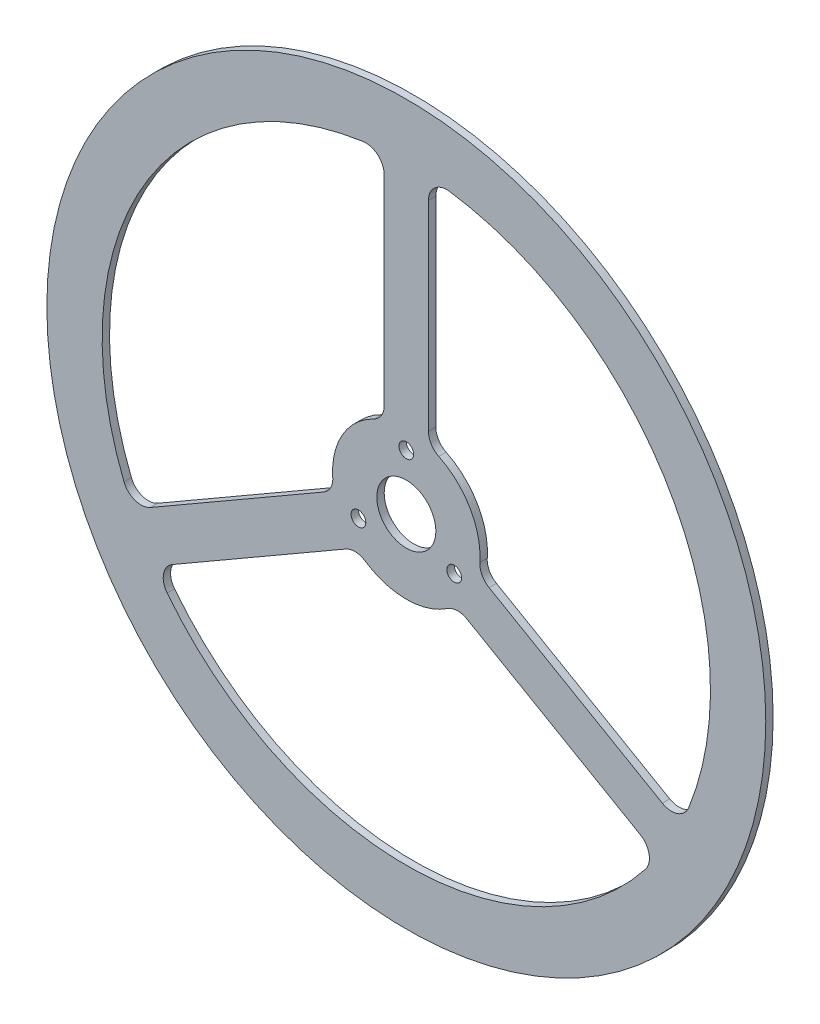
ISO-10303-21;
HEADER;
FILE_DESCRIPTION(('STEP AP214'),'2;1');
FILE_NAME('part.step','',(''),(''),'','','');
FILE_SCHEMA(('AUTOMOTIVE_DESIGN { 1 0 10303 214 1 1 1 1 }'));
ENDSEC;
DATA;
#1=APPLICATION_CONTEXT('core data for automotive mechanical design processes');
#2=APPLICATION_PROTOCOL_DEFINITION('international standard','automotive_design',2000,#1);
#3=PRODUCT_CONTEXT('',#1,'mechanical');
#4=PRODUCT('Part','Part','',(#3));
#5=PRODUCT_RELATED_PRODUCT_CATEGORY('part','',(#4));
#6=PRODUCT_DEFINITION_FORMATION('','',#4);
#7=PRODUCT_DEFINITION_CONTEXT('part definition',#1,'design');
#8=PRODUCT_DEFINITION('design','',#6,#7);
#9=PRODUCT_DEFINITION_SHAPE('','',#8);
#10=(LENGTH_UNIT() NAMED_UNIT(*) SI_UNIT(.MILLI.,.METRE.));
#11=(NAMED_UNIT(*) PLANE_ANGLE_UNIT() SI_UNIT($,.RADIAN.));
#12=(NAMED_UNIT(*) SI_UNIT($,.STERADIAN.) SOLID_ANGLE_UNIT());
#13=UNCERTAINTY_MEASURE_WITH_UNIT(LENGTH_MEASURE(1.E-05),#10,'distance_accuracy_value','');
#14=(GEOMETRIC_REPRESENTATION_CONTEXT(3) GLOBAL_UNCERTAINTY_ASSIGNED_CONTEXT((#13)) GLOBAL_UNIT_ASSIGNED_CONTEXT((#10,
#11,#12)) REPRESENTATION_CONTEXT('',''));
#15=CARTESIAN_POINT('',(0.,0.,0.));
#16=DIRECTION('',(0.,0.,1.));
#17=DIRECTION('',(1.,0.,0.));
#18=AXIS2_PLACEMENT_3D('',#15,#16,#17);
#19=CARTESIAN_POINT('',(0.,0.,2.));
#20=DIRECTION('',(0.,0.,-1.));
#21=DIRECTION('',(-1.,0.,0.));
#22=AXIS2_PLACEMENT_3D('',#19,#20,#21);
#23=CYLINDRICAL_SURFACE('',#22,97.5);
#24=CARTESIAN_POINT('',(0.,0.,2.));
#25=DIRECTION('',(0.,0.,1.));
#26=DIRECTION('',(1.,0.,0.));
#27=AXIS2_PLACEMENT_3D('',#24,#25,#26);
#28=CIRCLE('',#27,97.5);
#29=CARTESIAN_POINT('',(97.5,0.,2.));
#30=VERTEX_POINT('',#29);
#31=EDGE_CURVE('E11',#30,#30,#28,.T.);
#32=ORIENTED_EDGE('',*,*,#31,.F.);
#33=EDGE_LOOP('',(#32));
#34=FACE_BOUND('',#33,.T.);
#35=CARTESIAN_POINT('',(0.,0.,0.));
#36=DIRECTION('',(0.,0.,1.));
#37=DIRECTION('',(1.,0.,0.));
#38=AXIS2_PLACEMENT_3D('',#35,#36,#37);
#39=CIRCLE('',#38,97.5);
#40=CARTESIAN_POINT('',(97.5,0.,0.));
#41=VERTEX_POINT('',#40);
#42=EDGE_CURVE('E36',#41,#41,#39,.T.);
#43=ORIENTED_EDGE('',*,*,#42,.T.);
#44=EDGE_LOOP('',(#43));
#45=FACE_BOUND('',#44,.T.);
#46=ADVANCED_FACE('F33',(#34,#45),#23,.T.);
#47=CARTESIAN_POINT('',(0.,0.,2.));
#48=DIRECTION('',(0.,0.,1.));
#49=DIRECTION('',(1.,0.,0.));
#50=AXIS2_PLACEMENT_3D('',#47,#48,#49);
#51=PLANE('',#50);
#52=CARTESIAN_POINT('',(-12.9903810567666,-7.49999999999988,2.));
#53=DIRECTION('',(0.,0.,-1.));
#54=DIRECTION('',(0.499999999999992,-0.866025403784443,0.));
#55=AXIS2_PLACEMENT_3D('',#52,#53,#54);
#56=CIRCLE('',#55,2.);
#57=CARTESIAN_POINT('',(-11.9903810567667,-9.23205080756877,2.));
#58=VERTEX_POINT('',#57);
#59=EDGE_CURVE('E703',#58,#58,#56,.T.);
#60=ORIENTED_EDGE('',*,*,#59,.T.);
#61=EDGE_LOOP('',(#60));
#62=FACE_BOUND('',#61,.T.);
#63=CARTESIAN_POINT('',(12.9903810567665,-7.50000000000006,2.));
#64=DIRECTION('',(0.,0.,-1.));
#65=DIRECTION('',(0.500000000000004,0.866025403784436,0.));
#66=AXIS2_PLACEMENT_3D('',#63,#64,#65);
#67=CIRCLE('',#66,2.);
#68=CARTESIAN_POINT('',(13.9903810567666,-5.76794919243119,2.));
#69=VERTEX_POINT('',#68);
#70=EDGE_CURVE('E706',#69,#69,#67,.T.);
#71=ORIENTED_EDGE('',*,*,#70,.T.);
#72=EDGE_LOOP('',(#71));
#73=FACE_BOUND('',#72,.T.);
#74=CARTESIAN_POINT('',(0.,15.,2.));
#75=DIRECTION('',(0.,0.,-1.));
#76=DIRECTION('',(-1.,0.,0.));
#77=AXIS2_PLACEMENT_3D('',#74,#75,#76);
#78=CIRCLE('',#77,2.);
#79=CARTESIAN_POINT('',(-2.,15.,2.));
#80=VERTEX_POINT('',#79);
#81=EDGE_CURVE('E716',#80,#80,#78,.T.);
#82=ORIENTED_EDGE('',*,*,#81,.T.);
#83=EDGE_LOOP('',(#82));
#84=FACE_BOUND('',#83,.T.);
#85=CARTESIAN_POINT('',(-24.9422220952236,-1.698692718693,2.));
#86=DIRECTION('',(0.,0.,-1.));
#87=DIRECTION('',(1.,0.,0.));
#88=AXIS2_PLACEMENT_3D('',#85,#86,#87);
#89=CIRCLE('',#88,5.);
#90=CARTESIAN_POINT('',(-19.9537776761789,-1.3589541749544,2.));
#91=VERTEX_POINT('',#90);
#92=CARTESIAN_POINT('',(-22.4422220952236,-6.02881973761519,2.));
#93=VERTEX_POINT('',#92);
#94=EDGE_CURVE('E197',#91,#93,#89,.T.);
#95=ORIENTED_EDGE('',*,*,#94,.T.);
#96=DIRECTION('',(-0.866025403784439,-0.5,0.));
#97=VECTOR('',#96,1.);
#98=CARTESIAN_POINT('',(-22.4422220952236,-6.02881973761519,2.));
#99=LINE('',#98,#97);
#100=CARTESIAN_POINT('',(-69.4374706020631,-33.1615391136723,2.));
#101=VERTEX_POINT('',#100);
#102=EDGE_CURVE('E208',#93,#101,#99,.T.);
#103=ORIENTED_EDGE('',*,*,#102,.T.);
#104=CARTESIAN_POINT('',(-71.9374706020631,-28.8314120947501,2.));
#105=DIRECTION('',(0.,0.,-1.));
#106=DIRECTION('',(-1.,0.,0.));
#107=AXIS2_PLACEMENT_3D('',#104,#105,#106);
#108=CIRCLE('',#107,5.00000000000001);
#109=CARTESIAN_POINT('',(-76.5785977376801,-30.6915031976373,2.));
#110=VERTEX_POINT('',#109);
#111=EDGE_CURVE('E47',#101,#110,#108,.T.);
#112=ORIENTED_EDGE('',*,*,#111,.T.);
#113=CARTESIAN_POINT('',(0.,0.,2.));
#114=DIRECTION('',(0.,0.,-1.));
#115=DIRECTION('',(-1.,0.,0.));
#116=AXIS2_PLACEMENT_3D('',#113,#114,#115);
#117=CIRCLE('',#116,82.5);
#118=CARTESIAN_POINT('',(-11.7096774193548,81.6647626258391,2.));
#119=VERTEX_POINT('',#118);
#120=EDGE_CURVE('E226',#110,#119,#117,.T.);
#121=ORIENTED_EDGE('',*,*,#120,.T.);
#122=CARTESIAN_POINT('',(-11.,76.715383072758,2.));
#123=DIRECTION('',(0.,0.,-1.));
#124=DIRECTION('',(1.,0.,0.));
#125=AXIS2_PLACEMENT_3D('',#122,#123,#124);
#126=CIRCLE('',#125,5.);
#127=CARTESIAN_POINT('',(-6.,76.715383072758,2.));
#128=VERTEX_POINT('',#127);
#129=EDGE_CURVE('E229',#119,#128,#126,.T.);
#130=ORIENTED_EDGE('',*,*,#129,.T.);
#131=DIRECTION('',(0.,-1.,0.));
#132=VECTOR('',#131,1.);
#133=CARTESIAN_POINT('',(-5.99999999999999,22.4499443206436,2.));
#134=LINE('',#133,#132);
#135=CARTESIAN_POINT('',(-5.99999999999999,22.4499443206436,2.));
#136=VERTEX_POINT('',#135);
#137=EDGE_CURVE('E232',#128,#136,#134,.T.);
#138=ORIENTED_EDGE('',*,*,#137,.T.);
#139=CARTESIAN_POINT('',(-11.,22.4499443206436,2.));
#140=DIRECTION('',(0.,0.,-1.));
#141=DIRECTION('',(1.,0.,0.));
#142=AXIS2_PLACEMENT_3D('',#139,#140,#141);
#143=CIRCLE('',#142,5.);
#144=CARTESIAN_POINT('',(-8.8,17.9599554565149,2.));
#145=VERTEX_POINT('',#144);
#146=EDGE_CURVE('E235',#136,#145,#143,.T.);
#147=ORIENTED_EDGE('',*,*,#146,.T.);
#148=CARTESIAN_POINT('',(0.,0.,2.));
#149=DIRECTION('',(0.,0.,1.));
#150=DIRECTION('',(-1.,0.,0.));
#151=AXIS2_PLACEMENT_3D('',#148,#149,#150);
#152=CIRCLE('',#151,20.);
#153=EDGE_CURVE('E205',#145,#91,#152,.T.);
#154=ORIENTED_EDGE('',*,*,#153,.T.);
#155=EDGE_LOOP('',(#95,#103,#112,#121,#130,#138,#147,#154));
#156=FACE_BOUND('',#155,.T.);
#157=CARTESIAN_POINT('',(0.,0.,2.));
#158=DIRECTION('',(0.,0.,-1.));
#159=DIRECTION('',(-1.,0.,0.));
#160=AXIS2_PLACEMENT_3D('',#157,#158,#159);
#161=CIRCLE('',#160,8.);
#162=CARTESIAN_POINT('',(-8.,0.,2.));
#163=VERTEX_POINT('',#162);
#164=EDGE_CURVE('E240',#163,#163,#161,.T.);
#165=ORIENTED_EDGE('',*,*,#164,.T.);
#166=EDGE_LOOP('',(#165));
#167=FACE_BOUND('',#166,.T.);
#168=CARTESIAN_POINT('',(13.9422220952236,-20.7512516019506,2.));
#169=DIRECTION('',(0.,0.,-1.));
#170=DIRECTION('',(-1.,0.,0.));
#171=AXIS2_PLACEMENT_3D('',#168,#169,#170);
#172=CIRCLE('',#171,5.);
#173=CARTESIAN_POINT('',(11.1537776761789,-16.6010012815605,2.));
#174=VERTEX_POINT('',#173);
#175=CARTESIAN_POINT('',(16.4422220952236,-16.4211245830284,2.));
#176=VERTEX_POINT('',#175);
#177=EDGE_CURVE('E270',#174,#176,#172,.T.);
#178=ORIENTED_EDGE('',*,*,#177,.T.);
#179=DIRECTION('',(0.866025403784439,-0.5,0.));
#180=VECTOR('',#179,1.);
#181=CARTESIAN_POINT('',(16.4422220952236,-16.4211245830284,2.));
#182=LINE('',#181,#180);
#183=CARTESIAN_POINT('',(63.4374706020632,-43.5538439590856,2.));
#184=VERTEX_POINT('',#183);
#185=EDGE_CURVE('E273',#176,#184,#182,.T.);
#186=ORIENTED_EDGE('',*,*,#185,.T.);
#187=CARTESIAN_POINT('',(60.9374706020631,-47.8839709780078,2.));
#188=DIRECTION('',(0.,0.,-1.));
#189=DIRECTION('',(1.,0.,0.));
#190=AXIS2_PLACEMENT_3D('',#187,#188,#189);
#191=CIRCLE('',#190,5.);
#192=CARTESIAN_POINT('',(64.8689203183253,-50.9732594282018,2.));
#193=VERTEX_POINT('',#192);
#194=EDGE_CURVE('E55',#184,#193,#191,.T.);
#195=ORIENTED_EDGE('',*,*,#194,.T.);
#196=CARTESIAN_POINT('',(0.,0.,2.));
#197=DIRECTION('',(0.,0.,-1.));
#198=DIRECTION('',(-1.,0.,0.));
#199=AXIS2_PLACEMENT_3D('',#196,#197,#198);
#200=CIRCLE('',#199,82.5);
#201=CARTESIAN_POINT('',(-64.8689203183253,-50.9732594282018,2.));
#202=VERTEX_POINT('',#201);
#203=EDGE_CURVE('E278',#193,#202,#200,.T.);
#204=ORIENTED_EDGE('',*,*,#203,.T.);
#205=CARTESIAN_POINT('',(-60.9374706020631,-47.8839709780078,2.));
#206=DIRECTION('',(0.,0.,-1.));
#207=DIRECTION('',(-1.,0.,0.));
#208=AXIS2_PLACEMENT_3D('',#205,#206,#207);
#209=CIRCLE('',#208,5.00000000000001);
#210=CARTESIAN_POINT('',(-63.4374706020631,-43.5538439590856,2.));
#211=VERTEX_POINT('',#210);
#212=EDGE_CURVE('E281',#202,#211,#209,.T.);
#213=ORIENTED_EDGE('',*,*,#212,.T.);
#214=DIRECTION('',(0.866025403784439,0.5,0.));
#215=VECTOR('',#214,1.);
#216=CARTESIAN_POINT('',(-16.4422220952236,-16.4211245830285,2.));
#217=LINE('',#216,#215);
#218=CARTESIAN_POINT('',(-16.4422220952236,-16.4211245830285,2.));
#219=VERTEX_POINT('',#218);
#220=EDGE_CURVE('E284',#211,#219,#217,.T.);
#221=ORIENTED_EDGE('',*,*,#220,.T.);
#222=CARTESIAN_POINT('',(-13.9422220952236,-20.7512516019506,2.));
#223=DIRECTION('',(0.,0.,-1.));
#224=DIRECTION('',(1.,0.,0.));
#225=AXIS2_PLACEMENT_3D('',#222,#223,#224);
#226=CIRCLE('',#225,5.);
#227=CARTESIAN_POINT('',(-11.1537776761789,-16.6010012815605,2.));
#228=VERTEX_POINT('',#227);
#229=EDGE_CURVE('E287',#219,#228,#226,.T.);
#230=ORIENTED_EDGE('',*,*,#229,.T.);
#231=CARTESIAN_POINT('',(0.,0.,2.));
#232=DIRECTION('',(0.,0.,1.));
#233=DIRECTION('',(-1.,0.,0.));
#234=AXIS2_PLACEMENT_3D('',#231,#232,#233);
#235=CIRCLE('',#234,20.);
#236=EDGE_CURVE('E290',#228,#174,#235,.T.);
#237=ORIENTED_EDGE('',*,*,#236,.T.);
#238=EDGE_LOOP('',(#178,#186,#195,#204,#213,#221,#230,#237));
#239=FACE_BOUND('',#238,.T.);
#240=CARTESIAN_POINT('',(11.,22.4499443206437,2.));
#241=DIRECTION('',(0.,0.,-1.));
#242=DIRECTION('',(-1.,0.,0.));
#243=AXIS2_PLACEMENT_3D('',#240,#241,#242);
#244=CIRCLE('',#243,5.);
#245=CARTESIAN_POINT('',(8.79999999999999,17.9599554565149,2.));
#246=VERTEX_POINT('',#245);
#247=CARTESIAN_POINT('',(5.99999999999999,22.4499443206437,2.));
#248=VERTEX_POINT('',#247);
#249=EDGE_CURVE('E332',#246,#248,#244,.T.);
#250=ORIENTED_EDGE('',*,*,#249,.T.);
#251=DIRECTION('',(0.,1.,0.));
#252=VECTOR('',#251,1.);
#253=CARTESIAN_POINT('',(5.99999999999999,22.4499443206437,2.));
#254=LINE('',#253,#252);
#255=CARTESIAN_POINT('',(5.99999999999999,76.715383072758,2.));
#256=VERTEX_POINT('',#255);
#257=EDGE_CURVE('E335',#248,#256,#254,.T.);
#258=ORIENTED_EDGE('',*,*,#257,.T.);
#259=CARTESIAN_POINT('',(11.,76.715383072758,2.));
#260=DIRECTION('',(0.,0.,-1.));
#261=DIRECTION('',(-1.,0.,0.));
#262=AXIS2_PLACEMENT_3D('',#259,#260,#261);
#263=CIRCLE('',#262,5.);
#264=CARTESIAN_POINT('',(11.7096774193548,81.6647626258391,2.));
#265=VERTEX_POINT('',#264);
#266=EDGE_CURVE('E339',#256,#265,#263,.T.);
#267=ORIENTED_EDGE('',*,*,#266,.T.);
#268=CARTESIAN_POINT('',(0.,0.,2.));
#269=DIRECTION('',(0.,0.,-1.));
#270=DIRECTION('',(-1.,0.,0.));
#271=AXIS2_PLACEMENT_3D('',#268,#269,#270);
#272=CIRCLE('',#271,82.5);
#273=CARTESIAN_POINT('',(76.5785977376801,-30.6915031976373,2.));
#274=VERTEX_POINT('',#273);
#275=EDGE_CURVE('E342',#265,#274,#272,.T.);
#276=ORIENTED_EDGE('',*,*,#275,.T.);
#277=CARTESIAN_POINT('',(71.9374706020631,-28.8314120947501,2.));
#278=DIRECTION('',(0.,0.,-1.));
#279=DIRECTION('',(-1.,0.,0.));
#280=AXIS2_PLACEMENT_3D('',#277,#278,#279);
#281=CIRCLE('',#280,5.00000000000001);
#282=CARTESIAN_POINT('',(69.4374706020631,-33.1615391136723,2.));
#283=VERTEX_POINT('',#282);
#284=EDGE_CURVE('E345',#274,#283,#281,.T.);
#285=ORIENTED_EDGE('',*,*,#284,.T.);
#286=DIRECTION('',(-0.866025403784439,0.5,0.));
#287=VECTOR('',#286,1.);
#288=CARTESIAN_POINT('',(22.4422220952236,-6.02881973761519,2.));
#289=LINE('',#288,#287);
#290=CARTESIAN_POINT('',(22.4422220952236,-6.02881973761519,2.));
#291=VERTEX_POINT('',#290);
#292=EDGE_CURVE('E348',#283,#291,#289,.T.);
#293=ORIENTED_EDGE('',*,*,#292,.T.);
#294=CARTESIAN_POINT('',(24.9422220952236,-1.69869271869299,2.));
#295=DIRECTION('',(0.,0.,-1.));
#296=DIRECTION('',(1.,0.,0.));
#297=AXIS2_PLACEMENT_3D('',#294,#295,#296);
#298=CIRCLE('',#297,5.);
#299=CARTESIAN_POINT('',(19.9537776761789,-1.35895417495439,2.));
#300=VERTEX_POINT('',#299);
#301=EDGE_CURVE('E351',#291,#300,#298,.T.);
#302=ORIENTED_EDGE('',*,*,#301,.T.);
#303=CARTESIAN_POINT('',(0.,0.,2.));
#304=DIRECTION('',(0.,0.,1.));
#305=DIRECTION('',(-1.,0.,0.));
#306=AXIS2_PLACEMENT_3D('',#303,#304,#305);
#307=CIRCLE('',#306,20.);
#308=EDGE_CURVE('E354',#300,#246,#307,.T.);
#309=ORIENTED_EDGE('',*,*,#308,.T.);
#310=EDGE_LOOP('',(#250,#258,#267,#276,#285,#293,#302,#309));
#311=FACE_BOUND('',#310,.T.);
#312=ORIENTED_EDGE('',*,*,#31,.T.);
#313=EDGE_LOOP('',(#312));
#314=FACE_BOUND('',#313,.T.);
#315=ADVANCED_FACE('F212',(#62,#73,#84,#156,#167,#239,#311,#314),#51,.T.);
#316=CARTESIAN_POINT('',(0.,0.,0.));
#317=DIRECTION('',(0.,0.,1.));
#318=DIRECTION('',(1.,0.,0.));
#319=AXIS2_PLACEMENT_3D('',#316,#317,#318);
#320=PLANE('',#319);
#321=CARTESIAN_POINT('',(-12.9903810567666,-7.49999999999988,0.));
#322=DIRECTION('',(0.,0.,-1.));
#323=DIRECTION('',(0.499999999999992,-0.866025403784443,0.));
#324=AXIS2_PLACEMENT_3D('',#321,#322,#323);
#325=CIRCLE('',#324,2.);
#326=CARTESIAN_POINT('',(-11.9903810567667,-9.23205080756877,0.));
#327=VERTEX_POINT('',#326);
#328=EDGE_CURVE('E705',#327,#327,#325,.T.);
#329=ORIENTED_EDGE('',*,*,#328,.F.);
#330=EDGE_LOOP('',(#329));
#331=FACE_BOUND('',#330,.T.);
#332=CARTESIAN_POINT('',(12.9903810567665,-7.50000000000006,0.));
#333=DIRECTION('',(0.,0.,-1.));
#334=DIRECTION('',(0.500000000000004,0.866025403784436,0.));
#335=AXIS2_PLACEMENT_3D('',#332,#333,#334);
#336=CIRCLE('',#335,2.);
#337=CARTESIAN_POINT('',(13.9903810567666,-5.76794919243119,0.));
#338=VERTEX_POINT('',#337);
#339=EDGE_CURVE('E709',#338,#338,#336,.T.);
#340=ORIENTED_EDGE('',*,*,#339,.F.);
#341=EDGE_LOOP('',(#340));
#342=FACE_BOUND('',#341,.T.);
#343=CARTESIAN_POINT('',(0.,15.,0.));
#344=DIRECTION('',(0.,0.,-1.));
#345=DIRECTION('',(-1.,0.,0.));
#346=AXIS2_PLACEMENT_3D('',#343,#344,#345);
#347=CIRCLE('',#346,2.);
#348=CARTESIAN_POINT('',(-2.,15.,0.));
#349=VERTEX_POINT('',#348);
#350=EDGE_CURVE('E715',#349,#349,#347,.T.);
#351=ORIENTED_EDGE('',*,*,#350,.F.);
#352=EDGE_LOOP('',(#351));
#353=FACE_BOUND('',#352,.T.);
#354=DIRECTION('',(-0.866025403784439,-0.5,0.));
#355=VECTOR('',#354,1.);
#356=CARTESIAN_POINT('',(-22.4422220952236,-6.02881973761519,0.));
#357=LINE('',#356,#355);
#358=CARTESIAN_POINT('',(-22.4422220952236,-6.02881973761519,0.));
#359=VERTEX_POINT('',#358);
#360=CARTESIAN_POINT('',(-69.4374706020631,-33.1615391136723,0.));
#361=VERTEX_POINT('',#360);
#362=EDGE_CURVE('E239',#359,#361,#357,.T.);
#363=ORIENTED_EDGE('',*,*,#362,.F.);
#364=CARTESIAN_POINT('',(-24.9422220952236,-1.698692718693,0.));
#365=DIRECTION('',(0.,0.,-1.));
#366=DIRECTION('',(1.,0.,0.));
#367=AXIS2_PLACEMENT_3D('',#364,#365,#366);
#368=CIRCLE('',#367,5.);
#369=CARTESIAN_POINT('',(-19.9537776761789,-1.3589541749544,0.));
#370=VERTEX_POINT('',#369);
#371=EDGE_CURVE('E200',#370,#359,#368,.T.);
#372=ORIENTED_EDGE('',*,*,#371,.F.);
#373=CARTESIAN_POINT('',(0.,0.,0.));
#374=DIRECTION('',(0.,0.,1.));
#375=DIRECTION('',(-1.,0.,0.));
#376=AXIS2_PLACEMENT_3D('',#373,#374,#375);
#377=CIRCLE('',#376,20.);
#378=CARTESIAN_POINT('',(-8.8,17.9599554565149,0.));
#379=VERTEX_POINT('',#378);
#380=EDGE_CURVE('E216',#379,#370,#377,.T.);
#381=ORIENTED_EDGE('',*,*,#380,.F.);
#382=CARTESIAN_POINT('',(-11.,22.4499443206436,0.));
#383=DIRECTION('',(0.,0.,-1.));
#384=DIRECTION('',(1.,0.,0.));
#385=AXIS2_PLACEMENT_3D('',#382,#383,#384);
#386=CIRCLE('',#385,5.);
#387=CARTESIAN_POINT('',(-5.99999999999999,22.4499443206436,0.));
#388=VERTEX_POINT('',#387);
#389=EDGE_CURVE('E219',#388,#379,#386,.T.);
#390=ORIENTED_EDGE('',*,*,#389,.F.);
#391=DIRECTION('',(0.,-1.,0.));
#392=VECTOR('',#391,1.);
#393=CARTESIAN_POINT('',(-5.99999999999999,22.4499443206436,0.));
#394=LINE('',#393,#392);
#395=CARTESIAN_POINT('',(-6.,76.715383072758,0.));
#396=VERTEX_POINT('',#395);
#397=EDGE_CURVE('E251',#396,#388,#394,.T.);
#398=ORIENTED_EDGE('',*,*,#397,.F.);
#399=CARTESIAN_POINT('',(-11.,76.715383072758,0.));
#400=DIRECTION('',(0.,0.,-1.));
#401=DIRECTION('',(1.,0.,0.));
#402=AXIS2_PLACEMENT_3D('',#399,#400,#401);
#403=CIRCLE('',#402,5.);
#404=CARTESIAN_POINT('',(-11.7096774193548,81.6647626258391,0.));
#405=VERTEX_POINT('',#404);
#406=EDGE_CURVE('E248',#405,#396,#403,.T.);
#407=ORIENTED_EDGE('',*,*,#406,.F.);
#408=CARTESIAN_POINT('',(0.,0.,0.));
#409=DIRECTION('',(0.,0.,-1.));
#410=DIRECTION('',(-1.,0.,0.));
#411=AXIS2_PLACEMENT_3D('',#408,#409,#410);
#412=CIRCLE('',#411,82.5);
#413=CARTESIAN_POINT('',(-76.5785977376801,-30.6915031976373,0.));
#414=VERTEX_POINT('',#413);
#415=EDGE_CURVE('E245',#414,#405,#412,.T.);
#416=ORIENTED_EDGE('',*,*,#415,.F.);
#417=CARTESIAN_POINT('',(-71.9374706020631,-28.8314120947501,0.));
#418=DIRECTION('',(0.,0.,-1.));
#419=DIRECTION('',(-1.,0.,0.));
#420=AXIS2_PLACEMENT_3D('',#417,#418,#419);
#421=CIRCLE('',#420,5.00000000000001);
#422=EDGE_CURVE('E242',#361,#414,#421,.T.);
#423=ORIENTED_EDGE('',*,*,#422,.F.);
#424=EDGE_LOOP('',(#363,#372,#381,#390,#398,#407,#416,#423));
#425=FACE_BOUND('',#424,.T.);
#426=CARTESIAN_POINT('',(0.,0.,0.));
#427=DIRECTION('',(0.,0.,-1.));
#428=DIRECTION('',(-1.,0.,0.));
#429=AXIS2_PLACEMENT_3D('',#426,#427,#428);
#430=CIRCLE('',#429,8.);
#431=CARTESIAN_POINT('',(-8.,0.,0.));
#432=VERTEX_POINT('',#431);
#433=EDGE_CURVE('E222',#432,#432,#430,.T.);
#434=ORIENTED_EDGE('',*,*,#433,.F.);
#435=EDGE_LOOP('',(#434));
#436=FACE_BOUND('',#435,.T.);
#437=DIRECTION('',(0.866025403784439,-0.5,0.));
#438=VECTOR('',#437,1.);
#439=CARTESIAN_POINT('',(16.4422220952236,-16.4211245830284,0.));
#440=LINE('',#439,#438);
#441=CARTESIAN_POINT('',(16.4422220952236,-16.4211245830284,0.));
#442=VERTEX_POINT('',#441);
#443=CARTESIAN_POINT('',(63.4374706020631,-43.5538439590856,0.));
#444=VERTEX_POINT('',#443);
#445=EDGE_CURVE('E295',#442,#444,#440,.T.);
#446=ORIENTED_EDGE('',*,*,#445,.F.);
#447=CARTESIAN_POINT('',(13.9422220952236,-20.7512516019506,0.));
#448=DIRECTION('',(0.,0.,-1.));
#449=DIRECTION('',(-1.,0.,0.));
#450=AXIS2_PLACEMENT_3D('',#447,#448,#449);
#451=CIRCLE('',#450,5.);
#452=CARTESIAN_POINT('',(11.1537776761789,-16.6010012815605,0.));
#453=VERTEX_POINT('',#452);
#454=EDGE_CURVE('E258',#453,#442,#451,.T.);
#455=ORIENTED_EDGE('',*,*,#454,.F.);
#456=CARTESIAN_POINT('',(0.,0.,0.));
#457=DIRECTION('',(0.,0.,1.));
#458=DIRECTION('',(-1.,0.,0.));
#459=AXIS2_PLACEMENT_3D('',#456,#457,#458);
#460=CIRCLE('',#459,20.);
#461=CARTESIAN_POINT('',(-11.1537776761789,-16.6010012815605,0.));
#462=VERTEX_POINT('',#461);
#463=EDGE_CURVE('E274',#462,#453,#460,.T.);
#464=ORIENTED_EDGE('',*,*,#463,.F.);
#465=CARTESIAN_POINT('',(-13.9422220952236,-20.7512516019506,0.));
#466=DIRECTION('',(0.,0.,-1.));
#467=DIRECTION('',(1.,0.,0.));
#468=AXIS2_PLACEMENT_3D('',#465,#466,#467);
#469=CIRCLE('',#468,5.);
#470=CARTESIAN_POINT('',(-16.4422220952236,-16.4211245830285,0.));
#471=VERTEX_POINT('',#470);
#472=EDGE_CURVE('E310',#471,#462,#469,.T.);
#473=ORIENTED_EDGE('',*,*,#472,.F.);
#474=DIRECTION('',(0.866025403784439,0.5,0.));
#475=VECTOR('',#474,1.);
#476=CARTESIAN_POINT('',(-16.4422220952236,-16.4211245830285,0.));
#477=LINE('',#476,#475);
#478=CARTESIAN_POINT('',(-63.4374706020631,-43.5538439590856,0.));
#479=VERTEX_POINT('',#478);
#480=EDGE_CURVE('E307',#479,#471,#477,.T.);
#481=ORIENTED_EDGE('',*,*,#480,.F.);
#482=CARTESIAN_POINT('',(-60.9374706020631,-47.8839709780078,0.));
#483=DIRECTION('',(0.,0.,-1.));
#484=DIRECTION('',(-1.,0.,0.));
#485=AXIS2_PLACEMENT_3D('',#482,#483,#484);
#486=CIRCLE('',#485,5.00000000000001);
#487=CARTESIAN_POINT('',(-64.8689203183253,-50.9732594282018,0.));
#488=VERTEX_POINT('',#487);
#489=EDGE_CURVE('E304',#488,#479,#486,.T.);
#490=ORIENTED_EDGE('',*,*,#489,.F.);
#491=CARTESIAN_POINT('',(0.,0.,0.));
#492=DIRECTION('',(0.,0.,-1.));
#493=DIRECTION('',(-1.,0.,0.));
#494=AXIS2_PLACEMENT_3D('',#491,#492,#493);
#495=CIRCLE('',#494,82.5);
#496=CARTESIAN_POINT('',(64.8689203183253,-50.9732594282018,0.));
#497=VERTEX_POINT('',#496);
#498=EDGE_CURVE('E301',#497,#488,#495,.T.);
#499=ORIENTED_EDGE('',*,*,#498,.F.);
#500=CARTESIAN_POINT('',(60.9374706020631,-47.8839709780078,0.));
#501=DIRECTION('',(0.,0.,-1.));
#502=DIRECTION('',(1.,0.,0.));
#503=AXIS2_PLACEMENT_3D('',#500,#501,#502);
#504=CIRCLE('',#503,5.);
#505=EDGE_CURVE('E298',#444,#497,#504,.T.);
#506=ORIENTED_EDGE('',*,*,#505,.F.);
#507=EDGE_LOOP('',(#446,#455,#464,#473,#481,#490,#499,#506));
#508=FACE_BOUND('',#507,.T.);
#509=DIRECTION('',(0.,1.,0.));
#510=VECTOR('',#509,1.);
#511=CARTESIAN_POINT('',(5.99999999999999,22.4499443206437,0.));
#512=LINE('',#511,#510);
#513=CARTESIAN_POINT('',(5.99999999999999,22.4499443206437,0.));
#514=VERTEX_POINT('',#513);
#515=CARTESIAN_POINT('',(5.99999999999999,76.715383072758,0.));
#516=VERTEX_POINT('',#515);
#517=EDGE_CURVE('E359',#514,#516,#512,.T.);
#518=ORIENTED_EDGE('',*,*,#517,.F.);
#519=CARTESIAN_POINT('',(11.,22.4499443206437,0.));
#520=DIRECTION('',(0.,0.,-1.));
#521=DIRECTION('',(-1.,0.,0.));
#522=AXIS2_PLACEMENT_3D('',#519,#520,#521);
#523=CIRCLE('',#522,5.);
#524=CARTESIAN_POINT('',(8.79999999999999,17.9599554565149,0.));
#525=VERTEX_POINT('',#524);
#526=EDGE_CURVE('E317',#525,#514,#523,.T.);
#527=ORIENTED_EDGE('',*,*,#526,.F.);
#528=CARTESIAN_POINT('',(0.,0.,0.));
#529=DIRECTION('',(0.,0.,1.));
#530=DIRECTION('',(-1.,0.,0.));
#531=AXIS2_PLACEMENT_3D('',#528,#529,#530);
#532=CIRCLE('',#531,20.);
#533=CARTESIAN_POINT('',(19.9537776761789,-1.35895417495439,0.));
#534=VERTEX_POINT('',#533);
#535=EDGE_CURVE('E336',#534,#525,#532,.T.);
#536=ORIENTED_EDGE('',*,*,#535,.F.);
#537=CARTESIAN_POINT('',(24.9422220952236,-1.69869271869299,0.));
#538=DIRECTION('',(0.,0.,-1.));
#539=DIRECTION('',(1.,0.,0.));
#540=AXIS2_PLACEMENT_3D('',#537,#538,#539);
#541=CIRCLE('',#540,5.);
#542=CARTESIAN_POINT('',(22.4422220952236,-6.02881973761519,0.));
#543=VERTEX_POINT('',#542);
#544=EDGE_CURVE('E374',#543,#534,#541,.T.);
#545=ORIENTED_EDGE('',*,*,#544,.F.);
#546=DIRECTION('',(-0.866025403784439,0.5,0.));
#547=VECTOR('',#546,1.);
#548=CARTESIAN_POINT('',(22.4422220952236,-6.02881973761519,0.));
#549=LINE('',#548,#547);
#550=CARTESIAN_POINT('',(69.4374706020631,-33.1615391136723,0.));
#551=VERTEX_POINT('',#550);
#552=EDGE_CURVE('E371',#551,#543,#549,.T.);
#553=ORIENTED_EDGE('',*,*,#552,.F.);
#554=CARTESIAN_POINT('',(71.9374706020631,-28.8314120947501,0.));
#555=DIRECTION('',(0.,0.,-1.));
#556=DIRECTION('',(-1.,0.,0.));
#557=AXIS2_PLACEMENT_3D('',#554,#555,#556);
#558=CIRCLE('',#557,5.00000000000001);
#559=CARTESIAN_POINT('',(76.5785977376801,-30.6915031976373,0.));
#560=VERTEX_POINT('',#559);
#561=EDGE_CURVE('E368',#560,#551,#558,.T.);
#562=ORIENTED_EDGE('',*,*,#561,.F.);
#563=CARTESIAN_POINT('',(0.,0.,0.));
#564=DIRECTION('',(0.,0.,-1.));
#565=DIRECTION('',(-1.,0.,0.));
#566=AXIS2_PLACEMENT_3D('',#563,#564,#565);
#567=CIRCLE('',#566,82.5);
#568=CARTESIAN_POINT('',(11.7096774193548,81.6647626258391,0.));
#569=VERTEX_POINT('',#568);
#570=EDGE_CURVE('E365',#569,#560,#567,.T.);
#571=ORIENTED_EDGE('',*,*,#570,.F.);
#572=CARTESIAN_POINT('',(11.,76.715383072758,0.));
#573=DIRECTION('',(0.,0.,-1.));
#574=DIRECTION('',(-1.,0.,0.));
#575=AXIS2_PLACEMENT_3D('',#572,#573,#574);
#576=CIRCLE('',#575,5.);
#577=EDGE_CURVE('E362',#516,#569,#576,.T.);
#578=ORIENTED_EDGE('',*,*,#577,.F.);
#579=EDGE_LOOP('',(#518,#527,#536,#545,#553,#562,#571,#578));
#580=FACE_BOUND('',#579,.T.);
#581=ORIENTED_EDGE('',*,*,#42,.F.);
#582=EDGE_LOOP('',(#581));
#583=FACE_BOUND('',#582,.T.);
#584=ADVANCED_FACE('F404',(#331,#342,#353,#425,#436,#508,#580,#583),#320,.F.);
#585=CARTESIAN_POINT('',(11.,22.4499443206437,2.));
#586=DIRECTION('',(0.,0.,-1.));
#587=DIRECTION('',(-1.,0.,0.));
#588=AXIS2_PLACEMENT_3D('',#585,#586,#587);
#589=CYLINDRICAL_SURFACE('',#588,5.);
#590=ORIENTED_EDGE('',*,*,#526,.T.);
#591=DIRECTION('',(0.,0.,-1.));
#592=VECTOR('',#591,1.);
#593=CARTESIAN_POINT('',(5.99999999999999,22.4499443206437,2.));
#594=LINE('',#593,#592);
#595=EDGE_CURVE('E357',#248,#514,#594,.T.);
#596=ORIENTED_EDGE('',*,*,#595,.F.);
#597=ORIENTED_EDGE('',*,*,#249,.F.);
#598=DIRECTION('',(0.,0.,-1.));
#599=VECTOR('',#598,1.);
#600=CARTESIAN_POINT('',(8.79999999999999,17.9599554565149,2.));
#601=LINE('',#600,#599);
#602=EDGE_CURVE('E379',#246,#525,#601,.T.);
#603=ORIENTED_EDGE('',*,*,#602,.T.);
#604=EDGE_LOOP('',(#590,#596,#597,#603));
#605=FACE_BOUND('',#604,.T.);
#606=ADVANCED_FACE('F415',(#605),#589,.F.);
#607=CARTESIAN_POINT('',(0.,0.,2.));
#608=DIRECTION('',(0.,0.,-1.));
#609=DIRECTION('',(-1.,0.,0.));
#610=AXIS2_PLACEMENT_3D('',#607,#608,#609);
#611=CYLINDRICAL_SURFACE('',#610,20.);
#612=ORIENTED_EDGE('',*,*,#535,.T.);
#613=ORIENTED_EDGE('',*,*,#602,.F.);
#614=ORIENTED_EDGE('',*,*,#308,.F.);
#615=DIRECTION('',(0.,0.,-1.));
#616=VECTOR('',#615,1.);
#617=CARTESIAN_POINT('',(19.9537776761789,-1.35895417495439,2.));
#618=LINE('',#617,#616);
#619=EDGE_CURVE('E381',#300,#534,#618,.T.);
#620=ORIENTED_EDGE('',*,*,#619,.T.);
#621=EDGE_LOOP('',(#612,#613,#614,#620));
#622=FACE_BOUND('',#621,.T.);
#623=ADVANCED_FACE('F417',(#622),#611,.T.);
#624=CARTESIAN_POINT('',(24.9422220952236,-1.69869271869299,2.));
#625=DIRECTION('',(0.,0.,-1.));
#626=DIRECTION('',(-1.,0.,0.));
#627=AXIS2_PLACEMENT_3D('',#624,#625,#626);
#628=CYLINDRICAL_SURFACE('',#627,5.);
#629=ORIENTED_EDGE('',*,*,#544,.T.);
#630=ORIENTED_EDGE('',*,*,#619,.F.);
#631=ORIENTED_EDGE('',*,*,#301,.F.);
#632=DIRECTION('',(0.,0.,-1.));
#633=VECTOR('',#632,1.);
#634=CARTESIAN_POINT('',(22.4422220952236,-6.02881973761519,2.));
#635=LINE('',#634,#633);
#636=EDGE_CURVE('E383',#291,#543,#635,.T.);
#637=ORIENTED_EDGE('',*,*,#636,.T.);
#638=EDGE_LOOP('',(#629,#630,#631,#637));
#639=FACE_BOUND('',#638,.T.);
#640=ADVANCED_FACE('F421',(#639),#628,.F.);
#641=CARTESIAN_POINT('',(22.4422220952236,-6.02881973761519,2.));
#642=DIRECTION('',(-0.5,-0.866025403784439,0.));
#643=DIRECTION('',(0.866025403784439,-0.5,0.));
#644=AXIS2_PLACEMENT_3D('',#641,#642,#643);
#645=PLANE('',#644);
#646=ORIENTED_EDGE('',*,*,#552,.T.);
#647=ORIENTED_EDGE('',*,*,#636,.F.);
#648=ORIENTED_EDGE('',*,*,#292,.F.);
#649=DIRECTION('',(0.,0.,-1.));
#650=VECTOR('',#649,1.);
#651=CARTESIAN_POINT('',(69.4374706020631,-33.1615391136723,2.));
#652=LINE('',#651,#650);
#653=EDGE_CURVE('E385',#283,#551,#652,.T.);
#654=ORIENTED_EDGE('',*,*,#653,.T.);
#655=EDGE_LOOP('',(#646,#647,#648,#654));
#656=FACE_BOUND('',#655,.T.);
#657=ADVANCED_FACE('F425',(#656),#645,.F.);
#658=CARTESIAN_POINT('',(71.9374706020631,-28.8314120947501,2.));
#659=DIRECTION('',(0.,0.,-1.));
#660=DIRECTION('',(-1.,0.,0.));
#661=AXIS2_PLACEMENT_3D('',#658,#659,#660);
#662=CYLINDRICAL_SURFACE('',#661,5.00000000000001);
#663=ORIENTED_EDGE('',*,*,#561,.T.);
#664=ORIENTED_EDGE('',*,*,#653,.F.);
#665=ORIENTED_EDGE('',*,*,#284,.F.);
#666=DIRECTION('',(0.,0.,-1.));
#667=VECTOR('',#666,1.);
#668=CARTESIAN_POINT('',(76.5785977376801,-30.6915031976373,2.));
#669=LINE('',#668,#667);
#670=EDGE_CURVE('E387',#274,#560,#669,.T.);
#671=ORIENTED_EDGE('',*,*,#670,.T.);
#672=EDGE_LOOP('',(#663,#664,#665,#671));
#673=FACE_BOUND('',#672,.T.);
#674=ADVANCED_FACE('F428',(#673),#662,.F.);
#675=CARTESIAN_POINT('',(0.,0.,2.));
#676=DIRECTION('',(0.,0.,-1.));
#677=DIRECTION('',(-1.,0.,0.));
#678=AXIS2_PLACEMENT_3D('',#675,#676,#677);
#679=CYLINDRICAL_SURFACE('',#678,82.5);
#680=ORIENTED_EDGE('',*,*,#570,.T.);
#681=ORIENTED_EDGE('',*,*,#670,.F.);
#682=ORIENTED_EDGE('',*,*,#275,.F.);
#683=DIRECTION('',(0.,0.,-1.));
#684=VECTOR('',#683,1.);
#685=CARTESIAN_POINT('',(11.7096774193548,81.6647626258391,2.));
#686=LINE('',#685,#684);
#687=EDGE_CURVE('E389',#265,#569,#686,.T.);
#688=ORIENTED_EDGE('',*,*,#687,.T.);
#689=EDGE_LOOP('',(#680,#681,#682,#688));
#690=FACE_BOUND('',#689,.T.);
#691=ADVANCED_FACE('F430',(#690),#679,.F.);
#692=CARTESIAN_POINT('',(11.,76.715383072758,2.));
#693=DIRECTION('',(0.,0.,-1.));
#694=DIRECTION('',(-1.,0.,0.));
#695=AXIS2_PLACEMENT_3D('',#692,#693,#694);
#696=CYLINDRICAL_SURFACE('',#695,5.);
#697=ORIENTED_EDGE('',*,*,#577,.T.);
#698=ORIENTED_EDGE('',*,*,#687,.F.);
#699=ORIENTED_EDGE('',*,*,#266,.F.);
#700=DIRECTION('',(0.,0.,-1.));
#701=VECTOR('',#700,1.);
#702=CARTESIAN_POINT('',(5.99999999999999,76.715383072758,2.));
#703=LINE('',#702,#701);
#704=EDGE_CURVE('E391',#256,#516,#703,.T.);
#705=ORIENTED_EDGE('',*,*,#704,.T.);
#706=EDGE_LOOP('',(#697,#698,#699,#705));
#707=FACE_BOUND('',#706,.T.);
#708=ADVANCED_FACE('F410',(#707),#696,.F.);
#709=CARTESIAN_POINT('',(5.99999999999999,22.4499443206437,2.));
#710=DIRECTION('',(-1.,0.,0.));
#711=DIRECTION('',(0.,0.,1.));
#712=AXIS2_PLACEMENT_3D('',#709,#710,#711);
#713=PLANE('',#712);
#714=ORIENTED_EDGE('',*,*,#517,.T.);
#715=ORIENTED_EDGE('',*,*,#704,.F.);
#716=ORIENTED_EDGE('',*,*,#257,.F.);
#717=ORIENTED_EDGE('',*,*,#595,.T.);
#718=EDGE_LOOP('',(#714,#715,#716,#717));
#719=FACE_BOUND('',#718,.T.);
#720=ADVANCED_FACE('F397',(#719),#713,.F.);
#721=CARTESIAN_POINT('',(13.9422220952236,-20.7512516019506,2.));
#722=DIRECTION('',(0.,0.,-1.));
#723=DIRECTION('',(-1.,0.,0.));
#724=AXIS2_PLACEMENT_3D('',#721,#722,#723);
#725=CYLINDRICAL_SURFACE('',#724,5.);
#726=ORIENTED_EDGE('',*,*,#454,.T.);
#727=DIRECTION('',(0.,0.,-1.));
#728=VECTOR('',#727,1.);
#729=CARTESIAN_POINT('',(16.4422220952236,-16.4211245830284,2.));
#730=LINE('',#729,#728);
#731=EDGE_CURVE('E293',#176,#442,#730,.T.);
#732=ORIENTED_EDGE('',*,*,#731,.F.);
#733=ORIENTED_EDGE('',*,*,#177,.F.);
#734=DIRECTION('',(0.,0.,-1.));
#735=VECTOR('',#734,1.);
#736=CARTESIAN_POINT('',(11.1537776761789,-16.6010012815605,2.));
#737=LINE('',#736,#735);
#738=EDGE_CURVE('E315',#174,#453,#737,.T.);
#739=ORIENTED_EDGE('',*,*,#738,.T.);
#740=EDGE_LOOP('',(#726,#732,#733,#739));
#741=FACE_BOUND('',#740,.T.);
#742=ADVANCED_FACE('F460',(#741),#725,.F.);
#743=CARTESIAN_POINT('',(0.,0.,2.));
#744=DIRECTION('',(0.,0.,-1.));
#745=DIRECTION('',(-1.,0.,0.));
#746=AXIS2_PLACEMENT_3D('',#743,#744,#745);
#747=CYLINDRICAL_SURFACE('',#746,20.);
#748=ORIENTED_EDGE('',*,*,#463,.T.);
#749=ORIENTED_EDGE('',*,*,#738,.F.);
#750=ORIENTED_EDGE('',*,*,#236,.F.);
#751=DIRECTION('',(0.,0.,-1.));
#752=VECTOR('',#751,1.);
#753=CARTESIAN_POINT('',(-11.1537776761789,-16.6010012815605,2.));
#754=LINE('',#753,#752);
#755=EDGE_CURVE('E318',#228,#462,#754,.T.);
#756=ORIENTED_EDGE('',*,*,#755,.T.);
#757=EDGE_LOOP('',(#748,#749,#750,#756));
#758=FACE_BOUND('',#757,.T.);
#759=ADVANCED_FACE('F464',(#758),#747,.T.);
#760=CARTESIAN_POINT('',(-13.9422220952236,-20.7512516019506,2.));
#761=DIRECTION('',(0.,0.,-1.));
#762=DIRECTION('',(-1.,0.,0.));
#763=AXIS2_PLACEMENT_3D('',#760,#761,#762);
#764=CYLINDRICAL_SURFACE('',#763,5.);
#765=ORIENTED_EDGE('',*,*,#472,.T.);
#766=ORIENTED_EDGE('',*,*,#755,.F.);
#767=ORIENTED_EDGE('',*,*,#229,.F.);
#768=DIRECTION('',(0.,0.,-1.));
#769=VECTOR('',#768,1.);
#770=CARTESIAN_POINT('',(-16.4422220952236,-16.4211245830285,2.));
#771=LINE('',#770,#769);
#772=EDGE_CURVE('E320',#219,#471,#771,.T.);
#773=ORIENTED_EDGE('',*,*,#772,.T.);
#774=EDGE_LOOP('',(#765,#766,#767,#773));
#775=FACE_BOUND('',#774,.T.);
#776=ADVANCED_FACE('F470',(#775),#764,.F.);
#777=CARTESIAN_POINT('',(-16.4422220952236,-16.4211245830285,2.));
#778=DIRECTION('',(-0.5,0.866025403784439,0.));
#779=DIRECTION('',(-0.866025403784439,-0.5,0.));
#780=AXIS2_PLACEMENT_3D('',#777,#778,#779);
#781=PLANE('',#780);
#782=ORIENTED_EDGE('',*,*,#480,.T.);
#783=ORIENTED_EDGE('',*,*,#772,.F.);
#784=ORIENTED_EDGE('',*,*,#220,.F.);
#785=DIRECTION('',(0.,0.,-1.));
#786=VECTOR('',#785,1.);
#787=CARTESIAN_POINT('',(-63.4374706020631,-43.5538439590856,2.));
#788=LINE('',#787,#786);
#789=EDGE_CURVE('E322',#211,#479,#788,.T.);
#790=ORIENTED_EDGE('',*,*,#789,.T.);
#791=EDGE_LOOP('',(#782,#783,#784,#790));
#792=FACE_BOUND('',#791,.T.);
#793=ADVANCED_FACE('F523',(#792),#781,.F.);
#794=CARTESIAN_POINT('',(-60.9374706020631,-47.8839709780078,2.));
#795=DIRECTION('',(0.,0.,-1.));
#796=DIRECTION('',(-1.,0.,0.));
#797=AXIS2_PLACEMENT_3D('',#794,#795,#796);
#798=CYLINDRICAL_SURFACE('',#797,5.00000000000001);
#799=ORIENTED_EDGE('',*,*,#489,.T.);
#800=ORIENTED_EDGE('',*,*,#789,.F.);
#801=ORIENTED_EDGE('',*,*,#212,.F.);
#802=DIRECTION('',(0.,0.,-1.));
#803=VECTOR('',#802,1.);
#804=CARTESIAN_POINT('',(-64.8689203183253,-50.9732594282018,2.));
#805=LINE('',#804,#803);
#806=EDGE_CURVE('E324',#202,#488,#805,.T.);
#807=ORIENTED_EDGE('',*,*,#806,.T.);
#808=EDGE_LOOP('',(#799,#800,#801,#807));
#809=FACE_BOUND('',#808,.T.);
#810=ADVANCED_FACE('F533',(#809),#798,.F.);
#811=CARTESIAN_POINT('',(0.,0.,2.));
#812=DIRECTION('',(0.,0.,-1.));
#813=DIRECTION('',(-1.,0.,0.));
#814=AXIS2_PLACEMENT_3D('',#811,#812,#813);
#815=CYLINDRICAL_SURFACE('',#814,82.5);
#816=ORIENTED_EDGE('',*,*,#498,.T.);
#817=ORIENTED_EDGE('',*,*,#806,.F.);
#818=ORIENTED_EDGE('',*,*,#203,.F.);
#819=DIRECTION('',(0.,0.,-1.));
#820=VECTOR('',#819,1.);
#821=CARTESIAN_POINT('',(64.8689203183253,-50.9732594282018,2.));
#822=LINE('',#821,#820);
#823=EDGE_CURVE('E326',#193,#497,#822,.T.);
#824=ORIENTED_EDGE('',*,*,#823,.T.);
#825=EDGE_LOOP('',(#816,#817,#818,#824));
#826=FACE_BOUND('',#825,.T.);
#827=ADVANCED_FACE('F543',(#826),#815,.F.);
#828=CARTESIAN_POINT('',(60.9374706020631,-47.8839709780078,2.));
#829=DIRECTION('',(0.,0.,-1.));
#830=DIRECTION('',(-1.,0.,0.));
#831=AXIS2_PLACEMENT_3D('',#828,#829,#830);
#832=CYLINDRICAL_SURFACE('',#831,5.);
#833=ORIENTED_EDGE('',*,*,#505,.T.);
#834=ORIENTED_EDGE('',*,*,#823,.F.);
#835=ORIENTED_EDGE('',*,*,#194,.F.);
#836=DIRECTION('',(0.,0.,-1.));
#837=VECTOR('',#836,1.);
#838=CARTESIAN_POINT('',(63.4374706020631,-43.5538439590856,2.));
#839=LINE('',#838,#837);
#840=EDGE_CURVE('E328',#184,#444,#839,.T.);
#841=ORIENTED_EDGE('',*,*,#840,.T.);
#842=EDGE_LOOP('',(#833,#834,#835,#841));
#843=FACE_BOUND('',#842,.T.);
#844=ADVANCED_FACE('F553',(#843),#832,.F.);
#845=CARTESIAN_POINT('',(16.4422220952236,-16.4211245830284,2.));
#846=DIRECTION('',(0.5,0.866025403784439,0.));
#847=DIRECTION('',(-0.866025403784439,0.5,0.));
#848=AXIS2_PLACEMENT_3D('',#845,#846,#847);
#849=PLANE('',#848);
#850=ORIENTED_EDGE('',*,*,#445,.T.);
#851=ORIENTED_EDGE('',*,*,#840,.F.);
#852=ORIENTED_EDGE('',*,*,#185,.F.);
#853=ORIENTED_EDGE('',*,*,#731,.T.);
#854=EDGE_LOOP('',(#850,#851,#852,#853));
#855=FACE_BOUND('',#854,.T.);
#856=ADVANCED_FACE('F475',(#855),#849,.F.);
#857=CARTESIAN_POINT('',(0.,0.,2.));
#858=DIRECTION('',(0.,0.,-1.));
#859=DIRECTION('',(-1.,0.,0.));
#860=AXIS2_PLACEMENT_3D('',#857,#858,#859);
#861=CYLINDRICAL_SURFACE('',#860,8.);
#862=ORIENTED_EDGE('',*,*,#164,.F.);
#863=EDGE_LOOP('',(#862));
#864=FACE_BOUND('',#863,.T.);
#865=ORIENTED_EDGE('',*,*,#433,.T.);
#866=EDGE_LOOP('',(#865));
#867=FACE_BOUND('',#866,.T.);
#868=ADVANCED_FACE('F570',(#864,#867),#861,.F.);
#869=CARTESIAN_POINT('',(-24.9422220952236,-1.698692718693,2.));
#870=DIRECTION('',(0.,0.,-1.));
#871=DIRECTION('',(-1.,0.,0.));
#872=AXIS2_PLACEMENT_3D('',#869,#870,#871);
#873=CYLINDRICAL_SURFACE('',#872,5.);
#874=ORIENTED_EDGE('',*,*,#371,.T.);
#875=DIRECTION('',(0.,0.,-1.));
#876=VECTOR('',#875,1.);
#877=CARTESIAN_POINT('',(-22.4422220952236,-6.02881973761519,2.));
#878=LINE('',#877,#876);
#879=EDGE_CURVE('E193',#93,#359,#878,.T.);
#880=ORIENTED_EDGE('',*,*,#879,.F.);
#881=ORIENTED_EDGE('',*,*,#94,.F.);
#882=DIRECTION('',(0.,0.,-1.));
#883=VECTOR('',#882,1.);
#884=CARTESIAN_POINT('',(-19.9537776761789,-1.3589541749544,2.));
#885=LINE('',#884,#883);
#886=EDGE_CURVE('E256',#91,#370,#885,.T.);
#887=ORIENTED_EDGE('',*,*,#886,.T.);
#888=EDGE_LOOP('',(#874,#880,#881,#887));
#889=FACE_BOUND('',#888,.T.);
#890=ADVANCED_FACE('F195',(#889),#873,.F.);
#891=CARTESIAN_POINT('',(0.,0.,2.));
#892=DIRECTION('',(0.,0.,-1.));
#893=DIRECTION('',(-1.,0.,0.));
#894=AXIS2_PLACEMENT_3D('',#891,#892,#893);
#895=CYLINDRICAL_SURFACE('',#894,20.);
#896=ORIENTED_EDGE('',*,*,#380,.T.);
#897=ORIENTED_EDGE('',*,*,#886,.F.);
#898=ORIENTED_EDGE('',*,*,#153,.F.);
#899=DIRECTION('',(0.,0.,-1.));
#900=VECTOR('',#899,1.);
#901=CARTESIAN_POINT('',(-8.8,17.9599554565149,2.));
#902=LINE('',#901,#900);
#903=EDGE_CURVE('E259',#145,#379,#902,.T.);
#904=ORIENTED_EDGE('',*,*,#903,.T.);
#905=EDGE_LOOP('',(#896,#897,#898,#904));
#906=FACE_BOUND('',#905,.T.);
#907=ADVANCED_FACE('F588',(#906),#895,.T.);
#908=CARTESIAN_POINT('',(-11.,22.4499443206436,2.));
#909=DIRECTION('',(0.,0.,-1.));
#910=DIRECTION('',(-1.,0.,0.));
#911=AXIS2_PLACEMENT_3D('',#908,#909,#910);
#912=CYLINDRICAL_SURFACE('',#911,5.);
#913=ORIENTED_EDGE('',*,*,#389,.T.);
#914=ORIENTED_EDGE('',*,*,#903,.F.);
#915=ORIENTED_EDGE('',*,*,#146,.F.);
#916=DIRECTION('',(0.,0.,-1.));
#917=VECTOR('',#916,1.);
#918=CARTESIAN_POINT('',(-5.99999999999999,22.4499443206436,2.));
#919=LINE('',#918,#917);
#920=EDGE_CURVE('E261',#136,#388,#919,.T.);
#921=ORIENTED_EDGE('',*,*,#920,.T.);
#922=EDGE_LOOP('',(#913,#914,#915,#921));
#923=FACE_BOUND('',#922,.T.);
#924=ADVANCED_FACE('F597',(#923),#912,.F.);
#925=CARTESIAN_POINT('',(-5.99999999999999,22.4499443206436,2.));
#926=DIRECTION('',(1.,0.,0.));
#927=DIRECTION('',(0.,1.,0.));
#928=AXIS2_PLACEMENT_3D('',#925,#926,#927);
#929=PLANE('',#928);
#930=ORIENTED_EDGE('',*,*,#397,.T.);
#931=ORIENTED_EDGE('',*,*,#920,.F.);
#932=ORIENTED_EDGE('',*,*,#137,.F.);
#933=DIRECTION('',(0.,0.,-1.));
#934=VECTOR('',#933,1.);
#935=CARTESIAN_POINT('',(-6.,76.715383072758,2.));
#936=LINE('',#935,#934);
#937=EDGE_CURVE('E263',#128,#396,#936,.T.);
#938=ORIENTED_EDGE('',*,*,#937,.T.);
#939=EDGE_LOOP('',(#930,#931,#932,#938));
#940=FACE_BOUND('',#939,.T.);
#941=ADVANCED_FACE('F607',(#940),#929,.F.);
#942=CARTESIAN_POINT('',(-11.,76.715383072758,2.));
#943=DIRECTION('',(0.,0.,-1.));
#944=DIRECTION('',(-1.,0.,0.));
#945=AXIS2_PLACEMENT_3D('',#942,#943,#944);
#946=CYLINDRICAL_SURFACE('',#945,5.);
#947=ORIENTED_EDGE('',*,*,#406,.T.);
#948=ORIENTED_EDGE('',*,*,#937,.F.);
#949=ORIENTED_EDGE('',*,*,#129,.F.);
#950=DIRECTION('',(0.,0.,-1.));
#951=VECTOR('',#950,1.);
#952=CARTESIAN_POINT('',(-11.7096774193548,81.6647626258391,2.));
#953=LINE('',#952,#951);
#954=EDGE_CURVE('E265',#119,#405,#953,.T.);
#955=ORIENTED_EDGE('',*,*,#954,.T.);
#956=EDGE_LOOP('',(#947,#948,#949,#955));
#957=FACE_BOUND('',#956,.T.);
#958=ADVANCED_FACE('F617',(#957),#946,.F.);
#959=CARTESIAN_POINT('',(0.,0.,2.));
#960=DIRECTION('',(0.,0.,-1.));
#961=DIRECTION('',(-1.,0.,0.));
#962=AXIS2_PLACEMENT_3D('',#959,#960,#961);
#963=CYLINDRICAL_SURFACE('',#962,82.5);
#964=ORIENTED_EDGE('',*,*,#415,.T.);
#965=ORIENTED_EDGE('',*,*,#954,.F.);
#966=ORIENTED_EDGE('',*,*,#120,.F.);
#967=DIRECTION('',(0.,0.,-1.));
#968=VECTOR('',#967,1.);
#969=CARTESIAN_POINT('',(-76.5785977376801,-30.6915031976373,2.));
#970=LINE('',#969,#968);
#971=EDGE_CURVE('E267',#110,#414,#970,.T.);
#972=ORIENTED_EDGE('',*,*,#971,.T.);
#973=EDGE_LOOP('',(#964,#965,#966,#972));
#974=FACE_BOUND('',#973,.T.);
#975=ADVANCED_FACE('F627',(#974),#963,.F.);
#976=CARTESIAN_POINT('',(-71.9374706020631,-28.8314120947501,2.));
#977=DIRECTION('',(0.,0.,-1.));
#978=DIRECTION('',(-1.,0.,0.));
#979=AXIS2_PLACEMENT_3D('',#976,#977,#978);
#980=CYLINDRICAL_SURFACE('',#979,5.00000000000001);
#981=ORIENTED_EDGE('',*,*,#422,.T.);
#982=ORIENTED_EDGE('',*,*,#971,.F.);
#983=ORIENTED_EDGE('',*,*,#111,.F.);
#984=DIRECTION('',(0.,0.,-1.));
#985=VECTOR('',#984,1.);
#986=CARTESIAN_POINT('',(-69.4374706020631,-33.1615391136723,2.));
#987=LINE('',#986,#985);
#988=EDGE_CURVE('E204',#101,#361,#987,.T.);
#989=ORIENTED_EDGE('',*,*,#988,.T.);
#990=EDGE_LOOP('',(#981,#982,#983,#989));
#991=FACE_BOUND('',#990,.T.);
#992=ADVANCED_FACE('F637',(#991),#980,.F.);
#993=CARTESIAN_POINT('',(-22.4422220952236,-6.02881973761519,2.));
#994=DIRECTION('',(0.5,-0.866025403784439,0.));
#995=DIRECTION('',(0.866025403784439,0.5,0.));
#996=AXIS2_PLACEMENT_3D('',#993,#994,#995);
#997=PLANE('',#996);
#998=ORIENTED_EDGE('',*,*,#362,.T.);
#999=ORIENTED_EDGE('',*,*,#988,.F.);
#1000=ORIENTED_EDGE('',*,*,#102,.F.);
#1001=ORIENTED_EDGE('',*,*,#879,.T.);
#1002=EDGE_LOOP('',(#998,#999,#1000,#1001));
#1003=FACE_BOUND('',#1002,.T.);
#1004=ADVANCED_FACE('F209',(#1003),#997,.F.);
#1005=CARTESIAN_POINT('',(0.,15.,2.));
#1006=DIRECTION('',(0.,0.,-1.));
#1007=DIRECTION('',(-1.,0.,0.));
#1008=AXIS2_PLACEMENT_3D('',#1005,#1006,#1007);
#1009=CYLINDRICAL_SURFACE('',#1008,2.);
#1010=ORIENTED_EDGE('',*,*,#81,.F.);
#1011=EDGE_LOOP('',(#1010));
#1012=FACE_BOUND('',#1011,.T.);
#1013=ORIENTED_EDGE('',*,*,#350,.T.);
#1014=EDGE_LOOP('',(#1013));
#1015=FACE_BOUND('',#1014,.T.);
#1016=ADVANCED_FACE('F655',(#1012,#1015),#1009,.F.);
#1017=CARTESIAN_POINT('',(12.9903810567665,-7.50000000000006,2.));
#1018=DIRECTION('',(0.,0.,-1.));
#1019=DIRECTION('',(0.500000000000004,0.866025403784436,0.));
#1020=AXIS2_PLACEMENT_3D('',#1017,#1018,#1019);
#1021=CYLINDRICAL_SURFACE('',#1020,2.);
#1022=ORIENTED_EDGE('',*,*,#70,.F.);
#1023=EDGE_LOOP('',(#1022));
#1024=FACE_BOUND('',#1023,.T.);
#1025=ORIENTED_EDGE('',*,*,#339,.T.);
#1026=EDGE_LOOP('',(#1025));
#1027=FACE_BOUND('',#1026,.T.);
#1028=ADVANCED_FACE('F664',(#1024,#1027),#1021,.F.);
#1029=CARTESIAN_POINT('',(-12.9903810567666,-7.49999999999988,2.));
#1030=DIRECTION('',(0.,0.,-1.));
#1031=DIRECTION('',(0.499999999999992,-0.866025403784443,0.));
#1032=AXIS2_PLACEMENT_3D('',#1029,#1030,#1031);
#1033=CYLINDRICAL_SURFACE('',#1032,2.);
#1034=ORIENTED_EDGE('',*,*,#59,.F.);
#1035=EDGE_LOOP('',(#1034));
#1036=FACE_BOUND('',#1035,.T.);
#1037=ORIENTED_EDGE('',*,*,#328,.T.);
#1038=EDGE_LOOP('',(#1037));
#1039=FACE_BOUND('',#1038,.T.);
#1040=ADVANCED_FACE('F686',(#1036,#1039),#1033,.F.);
#1041=CLOSED_SHELL('',(#46,#315,#584,#606,#623,#640,#657,#674,#691,#708,#720,#742,#759,#776,
#793,#810,#827,#844,#856,#868,#890,#907,#924,#941,#958,#975,#992,#1004,#1016,#1028,#1040));
#1042=MANIFOLD_SOLID_BREP('B2',#1041);
#1043=ADVANCED_BREP_SHAPE_REPRESENTATION('',(#18,#1042),#14);
#1044=SHAPE_DEFINITION_REPRESENTATION(#9,#1043);
ENDSEC;
END-ISO-10303-21;
